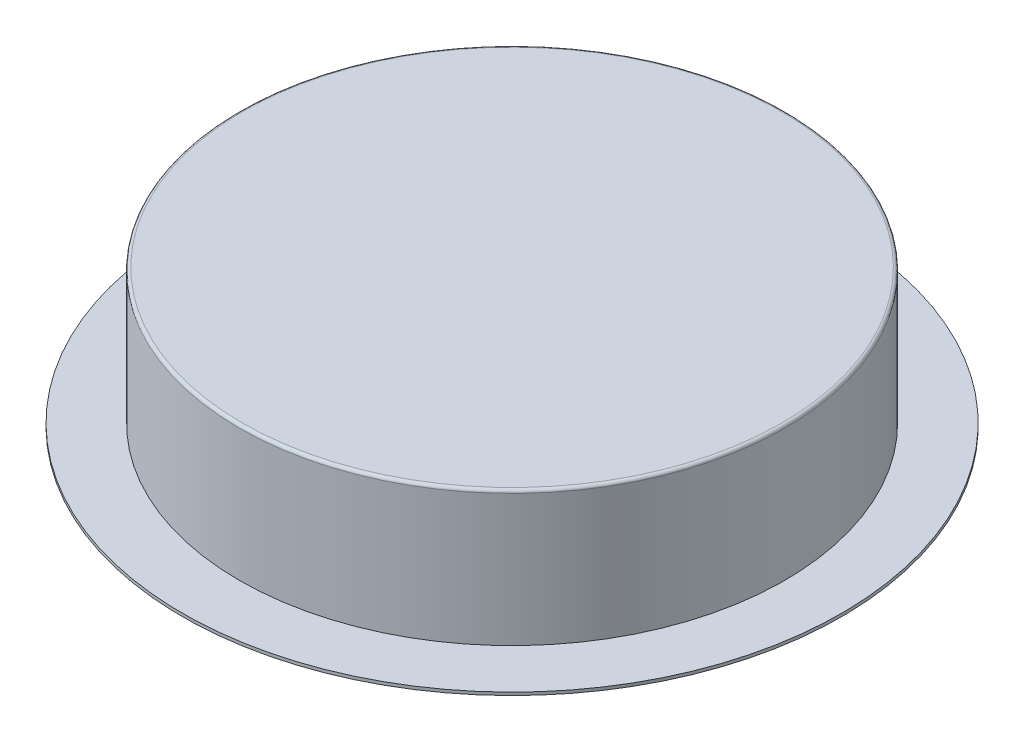
ISO-10303-21;
HEADER;
FILE_DESCRIPTION(('STEP AP214'),'2;1');
FILE_NAME('part.step','',(''),(''),'','','');
FILE_SCHEMA(('AUTOMOTIVE_DESIGN { 1 0 10303 214 1 1 1 1 }'));
ENDSEC;
DATA;
#1=APPLICATION_CONTEXT('core data for automotive mechanical design processes');
#2=APPLICATION_PROTOCOL_DEFINITION('international standard','automotive_design',2000,#1);
#3=PRODUCT_CONTEXT('',#1,'mechanical');
#4=PRODUCT('Part','Part','',(#3));
#5=PRODUCT_RELATED_PRODUCT_CATEGORY('part','',(#4));
#6=PRODUCT_DEFINITION_FORMATION('','',#4);
#7=PRODUCT_DEFINITION_CONTEXT('part definition',#1,'design');
#8=PRODUCT_DEFINITION('design','',#6,#7);
#9=PRODUCT_DEFINITION_SHAPE('','',#8);
#10=(LENGTH_UNIT() NAMED_UNIT(*) SI_UNIT(.MILLI.,.METRE.));
#11=(NAMED_UNIT(*) PLANE_ANGLE_UNIT() SI_UNIT($,.RADIAN.));
#12=(NAMED_UNIT(*) SI_UNIT($,.STERADIAN.) SOLID_ANGLE_UNIT());
#13=UNCERTAINTY_MEASURE_WITH_UNIT(LENGTH_MEASURE(1.E-05),#10,'distance_accuracy_value','');
#14=(GEOMETRIC_REPRESENTATION_CONTEXT(3) GLOBAL_UNCERTAINTY_ASSIGNED_CONTEXT((#13)) GLOBAL_UNIT_ASSIGNED_CONTEXT((#10,
#11,#12)) REPRESENTATION_CONTEXT('',''));
#15=CARTESIAN_POINT('',(0.,0.,0.));
#16=DIRECTION('',(0.,0.,1.));
#17=DIRECTION('',(1.,0.,0.));
#18=AXIS2_PLACEMENT_3D('',#15,#16,#17);
#19=CARTESIAN_POINT('',(0.,-0.5,0.));
#20=DIRECTION('',(0.,-1.,0.));
#21=DIRECTION('',(0.,0.,-1.));
#22=AXIS2_PLACEMENT_3D('',#19,#20,#21);
#23=PLANE('',#22);
#24=CARTESIAN_POINT('',(0.,-0.5,0.));
#25=DIRECTION('',(0.,-1.,0.));
#26=DIRECTION('',(0.,0.,-1.));
#27=AXIS2_PLACEMENT_3D('',#24,#25,#26);
#28=CIRCLE('',#27,55.);
#29=CARTESIAN_POINT('',(0.,-0.5,-55.));
#30=VERTEX_POINT('',#29);
#31=EDGE_CURVE('E11',#30,#30,#28,.T.);
#32=ORIENTED_EDGE('',*,*,#31,.T.);
#33=EDGE_LOOP('',(#32));
#34=FACE_BOUND('',#33,.T.);
#35=CARTESIAN_POINT('',(0.,-0.5,0.));
#36=DIRECTION('',(0.,-1.,0.));
#37=DIRECTION('',(0.,0.,-1.));
#38=AXIS2_PLACEMENT_3D('',#35,#36,#37);
#39=CIRCLE('',#38,45.);
#40=CARTESIAN_POINT('',(0.,-0.5,-45.));
#41=VERTEX_POINT('',#40);
#42=EDGE_CURVE('E48',#41,#41,#39,.T.);
#43=ORIENTED_EDGE('',*,*,#42,.F.);
#44=EDGE_LOOP('',(#43));
#45=FACE_BOUND('',#44,.T.);
#46=ADVANCED_FACE('F37',(#34,#45),#23,.T.);
#47=CARTESIAN_POINT('',(0.,0.,0.));
#48=DIRECTION('',(0.,-1.,0.));
#49=DIRECTION('',(0.,0.,-1.));
#50=AXIS2_PLACEMENT_3D('',#47,#48,#49);
#51=PLANE('',#50);
#52=CARTESIAN_POINT('',(0.,0.,0.));
#53=DIRECTION('',(0.,-1.,0.));
#54=DIRECTION('',(0.,0.,-1.));
#55=AXIS2_PLACEMENT_3D('',#52,#53,#54);
#56=CIRCLE('',#55,55.);
#57=CARTESIAN_POINT('',(0.,0.,-55.));
#58=VERTEX_POINT('',#57);
#59=EDGE_CURVE('E41',#58,#58,#56,.T.);
#60=ORIENTED_EDGE('',*,*,#59,.F.);
#61=EDGE_LOOP('',(#60));
#62=FACE_BOUND('',#61,.T.);
#63=CARTESIAN_POINT('',(0.,0.,0.));
#64=DIRECTION('',(0.,-1.,0.));
#65=DIRECTION('',(0.,0.,-1.));
#66=AXIS2_PLACEMENT_3D('',#63,#64,#65);
#67=CIRCLE('',#66,45.);
#68=CARTESIAN_POINT('',(0.,0.,-45.));
#69=VERTEX_POINT('',#68);
#70=EDGE_CURVE('E50',#69,#69,#67,.T.);
#71=ORIENTED_EDGE('',*,*,#70,.T.);
#72=EDGE_LOOP('',(#71));
#73=FACE_BOUND('',#72,.T.);
#74=ADVANCED_FACE('F60',(#62,#73),#51,.F.);
#75=CARTESIAN_POINT('',(0.,-0.5,0.));
#76=DIRECTION('',(0.,1.,0.));
#77=DIRECTION('',(0.,0.,1.));
#78=AXIS2_PLACEMENT_3D('',#75,#76,#77);
#79=CYLINDRICAL_SURFACE('',#78,55.);
#80=ORIENTED_EDGE('',*,*,#31,.F.);
#81=EDGE_LOOP('',(#80));
#82=FACE_BOUND('',#81,.T.);
#83=ORIENTED_EDGE('',*,*,#59,.T.);
#84=EDGE_LOOP('',(#83));
#85=FACE_BOUND('',#84,.T.);
#86=ADVANCED_FACE('F39',(#82,#85),#79,.T.);
#87=CARTESIAN_POINT('',(0.,-0.5,0.));
#88=DIRECTION('',(0.,1.,0.));
#89=DIRECTION('',(0.,0.,1.));
#90=AXIS2_PLACEMENT_3D('',#87,#88,#89);
#91=CYLINDRICAL_SURFACE('',#90,45.);
#92=ORIENTED_EDGE('',*,*,#42,.T.);
#93=EDGE_LOOP('',(#92));
#94=FACE_BOUND('',#93,.T.);
#95=ORIENTED_EDGE('',*,*,#70,.F.);
#96=EDGE_LOOP('',(#95));
#97=FACE_BOUND('',#96,.T.);
#98=ADVANCED_FACE('F56',(#94,#97),#91,.F.);
#99=CLOSED_SHELL('',(#46,#74,#86,#98));
#100=MANIFOLD_SOLID_BREP('B2',#99);
#101=CARTESIAN_POINT('',(0.,0.,0.));
#102=DIRECTION('',(0.,1.,0.));
#103=DIRECTION('',(0.,0.,1.));
#104=AXIS2_PLACEMENT_3D('',#101,#102,#103);
#105=PLANE('',#104);
#106=CARTESIAN_POINT('',(0.,0.,0.));
#107=DIRECTION('',(0.,1.,0.));
#108=DIRECTION('',(0.,0.,1.));
#109=AXIS2_PLACEMENT_3D('',#106,#107,#108);
#110=CIRCLE('',#109,45.5);
#111=CARTESIAN_POINT('',(0.,0.,45.5));
#112=VERTEX_POINT('',#111);
#113=EDGE_CURVE('E110',#112,#112,#110,.T.);
#114=ORIENTED_EDGE('',*,*,#113,.F.);
#115=EDGE_LOOP('',(#114));
#116=FACE_BOUND('',#115,.T.);
#117=CARTESIAN_POINT('',(0.,0.,0.));
#118=DIRECTION('',(0.,1.,0.));
#119=DIRECTION('',(0.,0.,1.));
#120=AXIS2_PLACEMENT_3D('',#117,#118,#119);
#121=CIRCLE('',#120,45.);
#122=CARTESIAN_POINT('',(0.,0.,45.));
#123=VERTEX_POINT('',#122);
#124=EDGE_CURVE('E114',#123,#123,#121,.T.);
#125=ORIENTED_EDGE('',*,*,#124,.T.);
#126=EDGE_LOOP('',(#125));
#127=FACE_BOUND('',#126,.T.);
#128=ADVANCED_FACE('F99',(#116,#127),#105,.F.);
#129=CARTESIAN_POINT('',(0.,22.,0.));
#130=DIRECTION('',(0.,-1.,0.));
#131=DIRECTION('',(0.,0.,-1.));
#132=AXIS2_PLACEMENT_3D('',#129,#130,#131);
#133=CYLINDRICAL_SURFACE('',#132,45.5);
#134=CARTESIAN_POINT('',(0.,22.,0.));
#135=DIRECTION('',(0.,1.,0.));
#136=DIRECTION('',(0.,0.,1.));
#137=AXIS2_PLACEMENT_3D('',#134,#135,#136);
#138=CIRCLE('',#137,45.5);
#139=CARTESIAN_POINT('',(0.,22.,45.5));
#140=VERTEX_POINT('',#139);
#141=EDGE_CURVE('E36',#140,#140,#138,.F.);
#142=ORIENTED_EDGE('',*,*,#141,.T.);
#143=EDGE_LOOP('',(#142));
#144=FACE_BOUND('',#143,.T.);
#145=ORIENTED_EDGE('',*,*,#113,.T.);
#146=EDGE_LOOP('',(#145));
#147=FACE_BOUND('',#146,.T.);
#148=ADVANCED_FACE('F135',(#144,#147),#133,.T.);
#149=CARTESIAN_POINT('',(0.,22.,0.));
#150=DIRECTION('',(0.,-1.,0.));
#151=DIRECTION('',(0.,0.,-1.));
#152=AXIS2_PLACEMENT_3D('',#149,#150,#151);
#153=CYLINDRICAL_SURFACE('',#152,45.);
#154=CARTESIAN_POINT('',(0.,22.,0.));
#155=DIRECTION('',(0.,1.,0.));
#156=DIRECTION('',(0.,0.,1.));
#157=AXIS2_PLACEMENT_3D('',#154,#155,#156);
#158=CIRCLE('',#157,45.);
#159=CARTESIAN_POINT('',(0.,22.,45.));
#160=VERTEX_POINT('',#159);
#161=EDGE_CURVE('E119',#160,#160,#158,.T.);
#162=ORIENTED_EDGE('',*,*,#161,.T.);
#163=EDGE_LOOP('',(#162));
#164=FACE_BOUND('',#163,.T.);
#165=ORIENTED_EDGE('',*,*,#124,.F.);
#166=EDGE_LOOP('',(#165));
#167=FACE_BOUND('',#166,.T.);
#168=ADVANCED_FACE('F123',(#164,#167),#153,.F.);
#169=CARTESIAN_POINT('',(0.,22.,0.));
#170=DIRECTION('',(0.,1.,0.));
#171=DIRECTION('',(0.,0.,1.));
#172=AXIS2_PLACEMENT_3D('',#169,#170,#171);
#173=PLANE('',#172);
#174=ORIENTED_EDGE('',*,*,#161,.F.);
#175=EDGE_LOOP('',(#174));
#176=FACE_BOUND('',#175,.T.);
#177=ADVANCED_FACE('F126',(#176),#173,.F.);
#178=CARTESIAN_POINT('',(0.,22.5,0.));
#179=DIRECTION('',(0.,1.,0.));
#180=DIRECTION('',(0.,0.,1.));
#181=AXIS2_PLACEMENT_3D('',#178,#179,#180);
#182=PLANE('',#181);
#183=CARTESIAN_POINT('',(0.,22.5,0.));
#184=DIRECTION('',(0.,1.,0.));
#185=DIRECTION('',(0.,0.,1.));
#186=AXIS2_PLACEMENT_3D('',#183,#184,#185);
#187=CIRCLE('',#186,45.);
#188=CARTESIAN_POINT('',(0.,22.5,45.));
#189=VERTEX_POINT('',#188);
#190=EDGE_CURVE('E106',#189,#189,#187,.T.);
#191=ORIENTED_EDGE('',*,*,#190,.T.);
#192=EDGE_LOOP('',(#191));
#193=FACE_BOUND('',#192,.T.);
#194=ADVANCED_FACE('F128',(#193),#182,.T.);
#195=CARTESIAN_POINT('',(0.,22.,0.));
#196=DIRECTION('',(0.,1.,0.));
#197=DIRECTION('',(0.,0.,1.));
#198=AXIS2_PLACEMENT_3D('',#195,#196,#197);
#199=TOROIDAL_SURFACE('',#198,45.,0.5);
#200=ORIENTED_EDGE('',*,*,#141,.F.);
#201=EDGE_LOOP('',(#200));
#202=FACE_BOUND('',#201,.T.);
#203=ORIENTED_EDGE('',*,*,#190,.F.);
#204=EDGE_LOOP('',(#203));
#205=FACE_BOUND('',#204,.T.);
#206=ADVANCED_FACE('F101',(#202,#205),#199,.T.);
#207=CLOSED_SHELL('',(#128,#148,#168,#177,#194,#206));
#208=MANIFOLD_SOLID_BREP('B6',#207);
#209=ADVANCED_BREP_SHAPE_REPRESENTATION('',(#18,#100,#208),#14);
#210=SHAPE_DEFINITION_REPRESENTATION(#9,#209);
ENDSEC;
END-ISO-10303-21;
